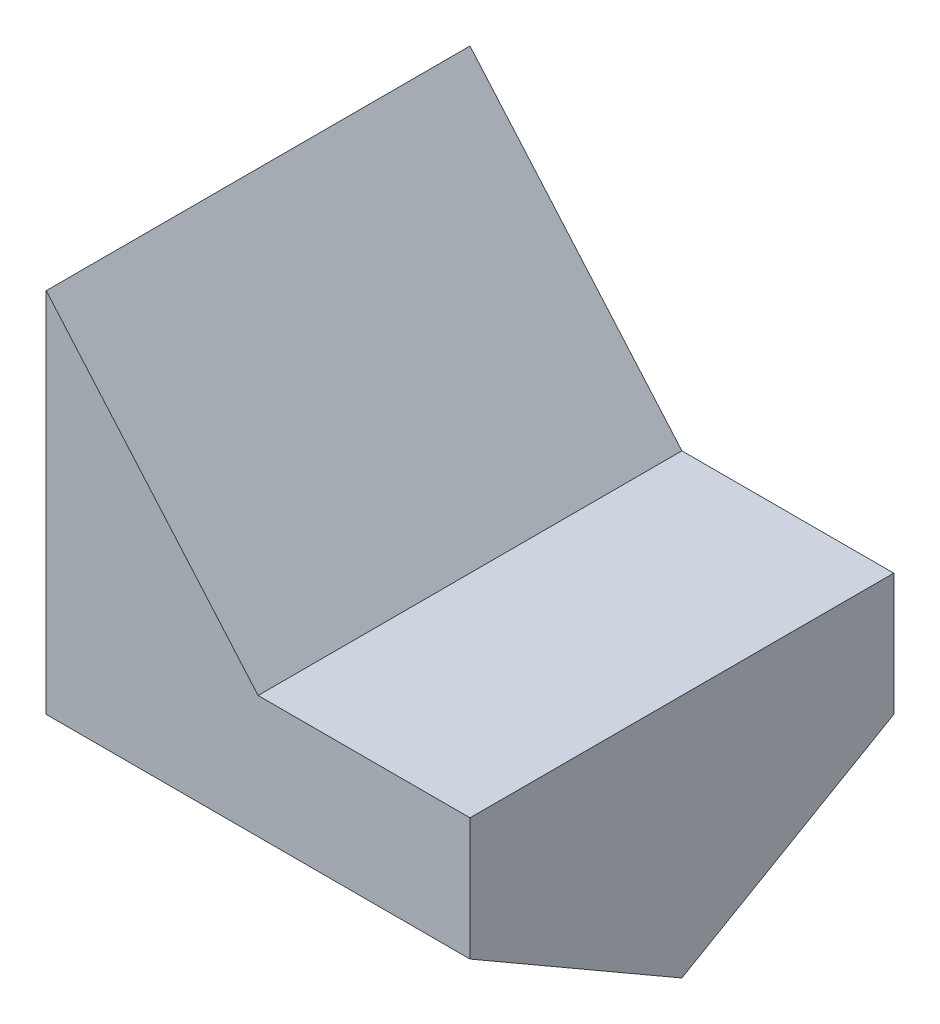
ISO-10303-21;
HEADER;
FILE_DESCRIPTION(('STEP AP214'),'2;1');
FILE_NAME('part.step','',(''),(''),'','','');
FILE_SCHEMA(('AUTOMOTIVE_DESIGN { 1 0 10303 214 1 1 1 1 }'));
ENDSEC;
DATA;
#1=APPLICATION_CONTEXT('core data for automotive mechanical design processes');
#2=APPLICATION_PROTOCOL_DEFINITION('international standard','automotive_design',2000,#1);
#3=PRODUCT_CONTEXT('',#1,'mechanical');
#4=PRODUCT('Part','Part','',(#3));
#5=PRODUCT_RELATED_PRODUCT_CATEGORY('part','',(#4));
#6=PRODUCT_DEFINITION_FORMATION('','',#4);
#7=PRODUCT_DEFINITION_CONTEXT('part definition',#1,'design');
#8=PRODUCT_DEFINITION('design','',#6,#7);
#9=PRODUCT_DEFINITION_SHAPE('','',#8);
#10=(LENGTH_UNIT() NAMED_UNIT(*) SI_UNIT(.MILLI.,.METRE.));
#11=(NAMED_UNIT(*) PLANE_ANGLE_UNIT() SI_UNIT($,.RADIAN.));
#12=(NAMED_UNIT(*) SI_UNIT($,.STERADIAN.) SOLID_ANGLE_UNIT());
#13=UNCERTAINTY_MEASURE_WITH_UNIT(LENGTH_MEASURE(1.E-05),#10,'distance_accuracy_value','');
#14=(GEOMETRIC_REPRESENTATION_CONTEXT(3) GLOBAL_UNCERTAINTY_ASSIGNED_CONTEXT((#13)) GLOBAL_UNIT_ASSIGNED_CONTEXT((#10,
#11,#12)) REPRESENTATION_CONTEXT('',''));
#15=CARTESIAN_POINT('',(0.,0.,0.));
#16=DIRECTION('',(0.,0.,1.));
#17=DIRECTION('',(1.,0.,0.));
#18=AXIS2_PLACEMENT_3D('',#15,#16,#17);
#19=CARTESIAN_POINT('',(60.,0.,-30.));
#20=DIRECTION('',(0.,0.,1.));
#21=DIRECTION('',(0.,-1.,0.));
#22=AXIS2_PLACEMENT_3D('',#19,#20,#21);
#23=PLANE('',#22);
#24=DIRECTION('',(0.654653670707977,-0.755928946018455,0.));
#25=VECTOR('',#24,1.);
#26=CARTESIAN_POINT('',(30.,0.,-30.));
#27=LINE('',#26,#25);
#28=CARTESIAN_POINT('',(0.,34.6410161513776,-30.));
#29=VERTEX_POINT('',#28);
#30=CARTESIAN_POINT('',(30.,0.,-30.));
#31=VERTEX_POINT('',#30);
#32=EDGE_CURVE('E105',#29,#31,#27,.T.);
#33=ORIENTED_EDGE('',*,*,#32,.T.);
#34=DIRECTION('',(1.,0.,0.));
#35=VECTOR('',#34,1.);
#36=CARTESIAN_POINT('',(60.,0.,-30.));
#37=LINE('',#36,#35);
#38=CARTESIAN_POINT('',(60.,0.,-30.));
#39=VERTEX_POINT('',#38);
#40=EDGE_CURVE('E137',#31,#39,#37,.T.);
#41=ORIENTED_EDGE('',*,*,#40,.T.);
#42=DIRECTION('',(0.,1.,0.));
#43=VECTOR('',#42,1.);
#44=CARTESIAN_POINT('',(60.,0.,-30.));
#45=LINE('',#44,#43);
#46=CARTESIAN_POINT('',(60.,-17.3205080756888,-30.));
#47=VERTEX_POINT('',#46);
#48=EDGE_CURVE('E123',#47,#39,#45,.T.);
#49=ORIENTED_EDGE('',*,*,#48,.F.);
#50=DIRECTION('',(-1.,0.,0.));
#51=VECTOR('',#50,1.);
#52=CARTESIAN_POINT('',(60.,-17.3205080756888,-30.));
#53=LINE('',#52,#51);
#54=CARTESIAN_POINT('',(0.,-17.3205080756888,-30.));
#55=VERTEX_POINT('',#54);
#56=EDGE_CURVE('E124',#47,#55,#53,.T.);
#57=ORIENTED_EDGE('',*,*,#56,.T.);
#58=DIRECTION('',(0.,1.,0.));
#59=VECTOR('',#58,1.);
#60=CARTESIAN_POINT('',(0.,0.,-30.));
#61=LINE('',#60,#59);
#62=EDGE_CURVE('E111',#55,#29,#61,.T.);
#63=ORIENTED_EDGE('',*,*,#62,.T.);
#64=EDGE_LOOP('',(#33,#41,#49,#57,#63));
#65=FACE_BOUND('',#64,.T.);
#66=ADVANCED_FACE('F37',(#65),#23,.F.);
#67=CARTESIAN_POINT('',(60.,0.,30.));
#68=DIRECTION('',(0.,0.,-1.));
#69=DIRECTION('',(-1.,0.,0.));
#70=AXIS2_PLACEMENT_3D('',#67,#68,#69);
#71=PLANE('',#70);
#72=DIRECTION('',(0.,-1.,0.));
#73=VECTOR('',#72,1.);
#74=CARTESIAN_POINT('',(60.,0.,30.));
#75=LINE('',#74,#73);
#76=CARTESIAN_POINT('',(60.,0.,30.));
#77=VERTEX_POINT('',#76);
#78=CARTESIAN_POINT('',(60.,-17.3205080756888,30.));
#79=VERTEX_POINT('',#78);
#80=EDGE_CURVE('E80',#77,#79,#75,.T.);
#81=ORIENTED_EDGE('',*,*,#80,.F.);
#82=DIRECTION('',(1.,0.,0.));
#83=VECTOR('',#82,1.);
#84=CARTESIAN_POINT('',(60.,0.,30.));
#85=LINE('',#84,#83);
#86=CARTESIAN_POINT('',(30.,0.,30.));
#87=VERTEX_POINT('',#86);
#88=EDGE_CURVE('E115',#87,#77,#85,.T.);
#89=ORIENTED_EDGE('',*,*,#88,.F.);
#90=DIRECTION('',(0.654653670707977,-0.755928946018455,0.));
#91=VECTOR('',#90,1.);
#92=CARTESIAN_POINT('',(30.,0.,30.));
#93=LINE('',#92,#91);
#94=CARTESIAN_POINT('',(0.,34.6410161513776,30.));
#95=VERTEX_POINT('',#94);
#96=EDGE_CURVE('E102',#95,#87,#93,.T.);
#97=ORIENTED_EDGE('',*,*,#96,.F.);
#98=DIRECTION('',(0.,-1.,0.));
#99=VECTOR('',#98,1.);
#100=CARTESIAN_POINT('',(0.,0.,30.));
#101=LINE('',#100,#99);
#102=CARTESIAN_POINT('',(0.,-17.3205080756888,30.));
#103=VERTEX_POINT('',#102);
#104=EDGE_CURVE('E110',#95,#103,#101,.T.);
#105=ORIENTED_EDGE('',*,*,#104,.T.);
#106=DIRECTION('',(-1.,0.,0.));
#107=VECTOR('',#106,1.);
#108=CARTESIAN_POINT('',(60.,-17.3205080756888,30.));
#109=LINE('',#108,#107);
#110=EDGE_CURVE('E11',#79,#103,#109,.T.);
#111=ORIENTED_EDGE('',*,*,#110,.F.);
#112=EDGE_LOOP('',(#81,#89,#97,#105,#111));
#113=FACE_BOUND('',#112,.T.);
#114=ADVANCED_FACE('F114',(#113),#71,.F.);
#115=CARTESIAN_POINT('',(60.,-25.9807621135332,15.));
#116=DIRECTION('',(0.,0.866025403784439,-0.5));
#117=DIRECTION('',(0.,0.5,0.866025403784439));
#118=AXIS2_PLACEMENT_3D('',#115,#116,#117);
#119=PLANE('',#118);
#120=DIRECTION('',(0.,-0.5,-0.866025403784439));
#121=VECTOR('',#120,1.);
#122=CARTESIAN_POINT('',(0.,-25.9807621135332,15.));
#123=LINE('',#122,#121);
#124=CARTESIAN_POINT('',(0.,-34.6410161513775,0.));
#125=VERTEX_POINT('',#124);
#126=EDGE_CURVE('E70',#103,#125,#123,.T.);
#127=ORIENTED_EDGE('',*,*,#126,.T.);
#128=DIRECTION('',(-1.,0.,0.));
#129=VECTOR('',#128,1.);
#130=CARTESIAN_POINT('',(60.,-34.6410161513775,0.));
#131=LINE('',#130,#129);
#132=CARTESIAN_POINT('',(60.,-34.6410161513775,0.));
#133=VERTEX_POINT('',#132);
#134=EDGE_CURVE('E45',#133,#125,#131,.T.);
#135=ORIENTED_EDGE('',*,*,#134,.F.);
#136=DIRECTION('',(0.,-0.5,-0.866025403784439));
#137=VECTOR('',#136,1.);
#138=CARTESIAN_POINT('',(60.,-25.9807621135332,15.));
#139=LINE('',#138,#137);
#140=EDGE_CURVE('E133',#79,#133,#139,.T.);
#141=ORIENTED_EDGE('',*,*,#140,.F.);
#142=ORIENTED_EDGE('',*,*,#110,.T.);
#143=EDGE_LOOP('',(#127,#135,#141,#142));
#144=FACE_BOUND('',#143,.T.);
#145=ADVANCED_FACE('F147',(#144),#119,.F.);
#146=CARTESIAN_POINT('',(60.,-25.9807621135332,-15.));
#147=DIRECTION('',(0.,0.866025403784439,0.5));
#148=DIRECTION('',(0.,-0.5,0.866025403784439));
#149=AXIS2_PLACEMENT_3D('',#146,#147,#148);
#150=PLANE('',#149);
#151=DIRECTION('',(0.,0.5,-0.866025403784439));
#152=VECTOR('',#151,1.);
#153=CARTESIAN_POINT('',(0.,-25.9807621135332,-15.));
#154=LINE('',#153,#152);
#155=EDGE_CURVE('E75',#125,#55,#154,.T.);
#156=ORIENTED_EDGE('',*,*,#155,.T.);
#157=ORIENTED_EDGE('',*,*,#56,.F.);
#158=DIRECTION('',(0.,0.5,-0.866025403784439));
#159=VECTOR('',#158,1.);
#160=CARTESIAN_POINT('',(60.,-25.9807621135332,-15.));
#161=LINE('',#160,#159);
#162=EDGE_CURVE('E53',#133,#47,#161,.T.);
#163=ORIENTED_EDGE('',*,*,#162,.F.);
#164=ORIENTED_EDGE('',*,*,#134,.T.);
#165=EDGE_LOOP('',(#156,#157,#163,#164));
#166=FACE_BOUND('',#165,.T.);
#167=ADVANCED_FACE('F125',(#166),#150,.F.);
#168=CARTESIAN_POINT('',(60.,0.,0.));
#169=DIRECTION('',(1.,0.,0.));
#170=DIRECTION('',(0.,0.,-1.));
#171=AXIS2_PLACEMENT_3D('',#168,#169,#170);
#172=PLANE('',#171);
#173=DIRECTION('',(0.,0.,1.));
#174=VECTOR('',#173,1.);
#175=CARTESIAN_POINT('',(60.,0.,-30.));
#176=LINE('',#175,#174);
#177=EDGE_CURVE('E128',#39,#77,#176,.T.);
#178=ORIENTED_EDGE('',*,*,#177,.T.);
#179=ORIENTED_EDGE('',*,*,#80,.T.);
#180=ORIENTED_EDGE('',*,*,#140,.T.);
#181=ORIENTED_EDGE('',*,*,#162,.T.);
#182=ORIENTED_EDGE('',*,*,#48,.T.);
#183=EDGE_LOOP('',(#178,#179,#180,#181,#182));
#184=FACE_BOUND('',#183,.T.);
#185=ADVANCED_FACE('F145',(#184),#172,.T.);
#186=CARTESIAN_POINT('',(0.,0.,0.));
#187=DIRECTION('',(1.,0.,0.));
#188=DIRECTION('',(0.,0.,-1.));
#189=AXIS2_PLACEMENT_3D('',#186,#187,#188);
#190=PLANE('',#189);
#191=ORIENTED_EDGE('',*,*,#62,.F.);
#192=ORIENTED_EDGE('',*,*,#155,.F.);
#193=ORIENTED_EDGE('',*,*,#126,.F.);
#194=ORIENTED_EDGE('',*,*,#104,.F.);
#195=DIRECTION('',(0.,0.,-1.));
#196=VECTOR('',#195,1.);
#197=CARTESIAN_POINT('',(0.,34.6410161513776,0.));
#198=LINE('',#197,#196);
#199=EDGE_CURVE('E99',#95,#29,#198,.T.);
#200=ORIENTED_EDGE('',*,*,#199,.T.);
#201=EDGE_LOOP('',(#191,#192,#193,#194,#200));
#202=FACE_BOUND('',#201,.T.);
#203=ADVANCED_FACE('F117',(#202),#190,.F.);
#204=CARTESIAN_POINT('',(60.,0.,-30.));
#205=DIRECTION('',(0.,-1.,0.));
#206=DIRECTION('',(0.,0.,-1.));
#207=AXIS2_PLACEMENT_3D('',#204,#205,#206);
#208=PLANE('',#207);
#209=ORIENTED_EDGE('',*,*,#177,.F.);
#210=ORIENTED_EDGE('',*,*,#40,.F.);
#211=DIRECTION('',(0.,0.,1.));
#212=VECTOR('',#211,1.);
#213=CARTESIAN_POINT('',(30.,0.,-30.));
#214=LINE('',#213,#212);
#215=EDGE_CURVE('E129',#31,#87,#214,.T.);
#216=ORIENTED_EDGE('',*,*,#215,.T.);
#217=ORIENTED_EDGE('',*,*,#88,.T.);
#218=EDGE_LOOP('',(#209,#210,#216,#217));
#219=FACE_BOUND('',#218,.T.);
#220=ADVANCED_FACE('F143',(#219),#208,.F.);
#221=CARTESIAN_POINT('',(30.,0.,-30.));
#222=DIRECTION('',(-0.755928946018455,-0.654653670707977,0.));
#223=DIRECTION('',(0.654653670707977,-0.755928946018455,0.));
#224=AXIS2_PLACEMENT_3D('',#221,#222,#223);
#225=PLANE('',#224);
#226=ORIENTED_EDGE('',*,*,#215,.F.);
#227=ORIENTED_EDGE('',*,*,#32,.F.);
#228=ORIENTED_EDGE('',*,*,#199,.F.);
#229=ORIENTED_EDGE('',*,*,#96,.T.);
#230=EDGE_LOOP('',(#226,#227,#228,#229));
#231=FACE_BOUND('',#230,.T.);
#232=ADVANCED_FACE('F101',(#231),#225,.F.);
#233=CLOSED_SHELL('',(#66,#114,#145,#167,#185,#203,#220,#232));
#234=MANIFOLD_SOLID_BREP('B2',#233);
#235=ADVANCED_BREP_SHAPE_REPRESENTATION('',(#18,#234),#14);
#236=SHAPE_DEFINITION_REPRESENTATION(#9,#235);
ENDSEC;
END-ISO-10303-21;
